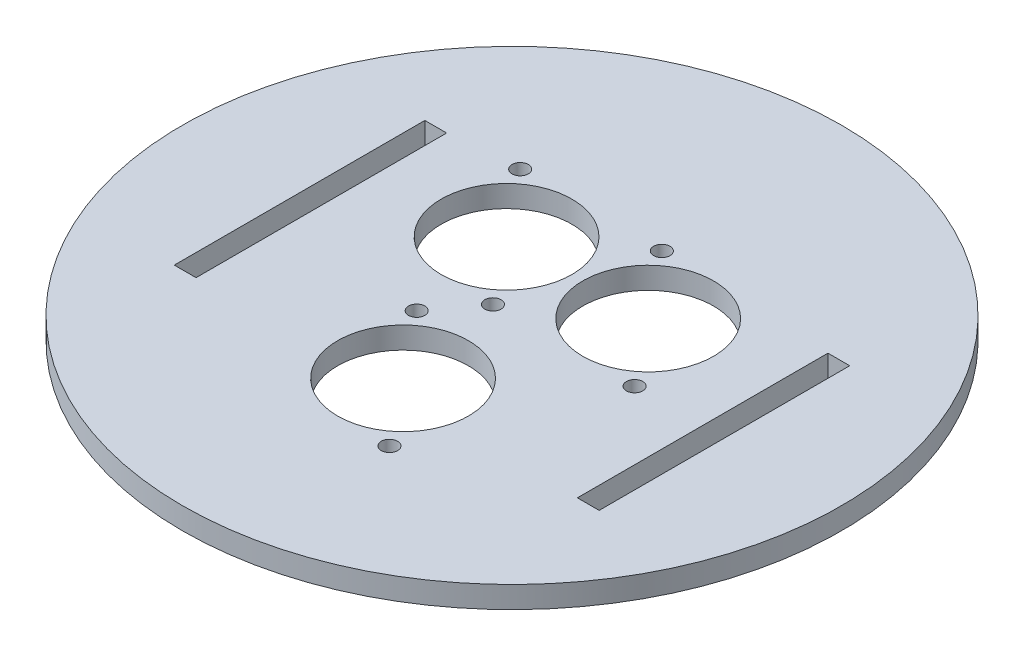
ISO-10303-21;
HEADER;
FILE_DESCRIPTION(('STEP AP214'),'2;1');
FILE_NAME('part.step','',(''),(''),'','','');
FILE_SCHEMA(('AUTOMOTIVE_DESIGN { 1 0 10303 214 1 1 1 1 }'));
ENDSEC;
DATA;
#1=APPLICATION_CONTEXT('core data for automotive mechanical design processes');
#2=APPLICATION_PROTOCOL_DEFINITION('international standard','automotive_design',2000,#1);
#3=PRODUCT_CONTEXT('',#1,'mechanical');
#4=PRODUCT('Part','Part','',(#3));
#5=PRODUCT_RELATED_PRODUCT_CATEGORY('part','',(#4));
#6=PRODUCT_DEFINITION_FORMATION('','',#4);
#7=PRODUCT_DEFINITION_CONTEXT('part definition',#1,'design');
#8=PRODUCT_DEFINITION('design','',#6,#7);
#9=PRODUCT_DEFINITION_SHAPE('','',#8);
#10=(LENGTH_UNIT() NAMED_UNIT(*) SI_UNIT(.MILLI.,.METRE.));
#11=(NAMED_UNIT(*) PLANE_ANGLE_UNIT() SI_UNIT($,.RADIAN.));
#12=(NAMED_UNIT(*) SI_UNIT($,.STERADIAN.) SOLID_ANGLE_UNIT());
#13=UNCERTAINTY_MEASURE_WITH_UNIT(LENGTH_MEASURE(1.E-05),#10,'distance_accuracy_value','');
#14=(GEOMETRIC_REPRESENTATION_CONTEXT(3) GLOBAL_UNCERTAINTY_ASSIGNED_CONTEXT((#13)) GLOBAL_UNIT_ASSIGNED_CONTEXT((#10,
#11,#12)) REPRESENTATION_CONTEXT('',''));
#15=CARTESIAN_POINT('',(0.,0.,0.));
#16=DIRECTION('',(0.,0.,1.));
#17=DIRECTION('',(1.,0.,0.));
#18=AXIS2_PLACEMENT_3D('',#15,#16,#17);
#19=CARTESIAN_POINT('',(0.,4.,0.));
#20=DIRECTION('',(0.,1.,0.));
#21=DIRECTION('',(0.,0.,1.));
#22=AXIS2_PLACEMENT_3D('',#19,#20,#21);
#23=PLANE('',#22);
#24=DIRECTION('',(0.,0.,-1.));
#25=VECTOR('',#24,1.);
#26=CARTESIAN_POINT('',(-35.,4.,23.));
#27=LINE('',#26,#25);
#28=CARTESIAN_POINT('',(-35.,4.,23.));
#29=VERTEX_POINT('',#28);
#30=CARTESIAN_POINT('',(-35.,4.,-23.));
#31=VERTEX_POINT('',#30);
#32=EDGE_CURVE('E130',#29,#31,#27,.T.);
#33=ORIENTED_EDGE('',*,*,#32,.F.);
#34=DIRECTION('',(1.,0.,0.));
#35=VECTOR('',#34,1.);
#36=CARTESIAN_POINT('',(-39.,4.,23.));
#37=LINE('',#36,#35);
#38=CARTESIAN_POINT('',(-39.,4.,23.));
#39=VERTEX_POINT('',#38);
#40=EDGE_CURVE('E138',#39,#29,#37,.T.);
#41=ORIENTED_EDGE('',*,*,#40,.F.);
#42=DIRECTION('',(0.,0.,1.));
#43=VECTOR('',#42,1.);
#44=CARTESIAN_POINT('',(-39.,4.,23.));
#45=LINE('',#44,#43);
#46=CARTESIAN_POINT('',(-39.,4.,-23.));
#47=VERTEX_POINT('',#46);
#48=EDGE_CURVE('E152',#47,#39,#45,.T.);
#49=ORIENTED_EDGE('',*,*,#48,.F.);
#50=DIRECTION('',(-1.,0.,0.));
#51=VECTOR('',#50,1.);
#52=CARTESIAN_POINT('',(-39.,4.,-23.));
#53=LINE('',#52,#51);
#54=EDGE_CURVE('E149',#31,#47,#53,.T.);
#55=ORIENTED_EDGE('',*,*,#54,.F.);
#56=EDGE_LOOP('',(#33,#41,#49,#55));
#57=FACE_BOUND('',#56,.T.);
#58=CARTESIAN_POINT('',(-22.5,4.,-24.));
#59=DIRECTION('',(0.,1.,0.));
#60=DIRECTION('',(0.,0.,1.));
#61=AXIS2_PLACEMENT_3D('',#58,#59,#60);
#62=CIRCLE('',#61,1.49999999999999);
#63=CARTESIAN_POINT('',(-22.5,4.,-22.5));
#64=VERTEX_POINT('',#63);
#65=EDGE_CURVE('E159',#64,#64,#62,.T.);
#66=ORIENTED_EDGE('',*,*,#65,.F.);
#67=EDGE_LOOP('',(#66));
#68=FACE_BOUND('',#67,.T.);
#69=CARTESIAN_POINT('',(-3.5,4.,0.));
#70=DIRECTION('',(0.,1.,0.));
#71=DIRECTION('',(0.,0.,1.));
#72=AXIS2_PLACEMENT_3D('',#69,#70,#71);
#73=CIRCLE('',#72,1.49999999999999);
#74=CARTESIAN_POINT('',(-3.5,4.,1.49999999999999));
#75=VERTEX_POINT('',#74);
#76=EDGE_CURVE('E171',#75,#75,#73,.T.);
#77=ORIENTED_EDGE('',*,*,#76,.F.);
#78=EDGE_LOOP('',(#77));
#79=FACE_BOUND('',#78,.T.);
#80=CARTESIAN_POINT('',(3.5,4.,-24.));
#81=DIRECTION('',(0.,1.,0.));
#82=DIRECTION('',(0.,0.,1.));
#83=AXIS2_PLACEMENT_3D('',#80,#81,#82);
#84=CIRCLE('',#83,1.49999999999999);
#85=CARTESIAN_POINT('',(3.5,4.,-22.5));
#86=VERTEX_POINT('',#85);
#87=EDGE_CURVE('E177',#86,#86,#84,.T.);
#88=ORIENTED_EDGE('',*,*,#87,.F.);
#89=EDGE_LOOP('',(#88));
#90=FACE_BOUND('',#89,.T.);
#91=CARTESIAN_POINT('',(22.5,4.,0.));
#92=DIRECTION('',(0.,1.,0.));
#93=DIRECTION('',(0.,0.,1.));
#94=AXIS2_PLACEMENT_3D('',#91,#92,#93);
#95=CIRCLE('',#94,1.49999999999999);
#96=CARTESIAN_POINT('',(22.5,4.,1.49999999999999));
#97=VERTEX_POINT('',#96);
#98=EDGE_CURVE('E183',#97,#97,#95,.T.);
#99=ORIENTED_EDGE('',*,*,#98,.F.);
#100=EDGE_LOOP('',(#99));
#101=FACE_BOUND('',#100,.T.);
#102=CARTESIAN_POINT('',(-9.5,4.,8.));
#103=DIRECTION('',(0.,1.,0.));
#104=DIRECTION('',(0.,0.,1.));
#105=AXIS2_PLACEMENT_3D('',#102,#103,#104);
#106=CIRCLE('',#105,1.49999999999999);
#107=CARTESIAN_POINT('',(-9.5,4.,9.49999999999999));
#108=VERTEX_POINT('',#107);
#109=EDGE_CURVE('E189',#108,#108,#106,.T.);
#110=ORIENTED_EDGE('',*,*,#109,.F.);
#111=EDGE_LOOP('',(#110));
#112=FACE_BOUND('',#111,.T.);
#113=CARTESIAN_POINT('',(9.5,4.,32.));
#114=DIRECTION('',(0.,1.,0.));
#115=DIRECTION('',(0.,0.,1.));
#116=AXIS2_PLACEMENT_3D('',#113,#114,#115);
#117=CIRCLE('',#116,1.49999999999999);
#118=CARTESIAN_POINT('',(9.5,4.,33.5));
#119=VERTEX_POINT('',#118);
#120=EDGE_CURVE('E195',#119,#119,#117,.T.);
#121=ORIENTED_EDGE('',*,*,#120,.F.);
#122=EDGE_LOOP('',(#121));
#123=FACE_BOUND('',#122,.T.);
#124=CARTESIAN_POINT('',(0.,4.,20.));
#125=DIRECTION('',(0.,1.,0.));
#126=DIRECTION('',(0.,0.,1.));
#127=AXIS2_PLACEMENT_3D('',#124,#125,#126);
#128=CIRCLE('',#127,12.);
#129=CARTESIAN_POINT('',(0.,4.,32.));
#130=VERTEX_POINT('',#129);
#131=EDGE_CURVE('E205',#130,#130,#128,.T.);
#132=ORIENTED_EDGE('',*,*,#131,.F.);
#133=EDGE_LOOP('',(#132));
#134=FACE_BOUND('',#133,.T.);
#135=CARTESIAN_POINT('',(13.,4.,-12.));
#136=DIRECTION('',(0.,1.,0.));
#137=DIRECTION('',(0.,0.,1.));
#138=AXIS2_PLACEMENT_3D('',#135,#136,#137);
#139=CIRCLE('',#138,12.);
#140=CARTESIAN_POINT('',(13.,4.,0.));
#141=VERTEX_POINT('',#140);
#142=EDGE_CURVE('E208',#141,#141,#139,.T.);
#143=ORIENTED_EDGE('',*,*,#142,.F.);
#144=EDGE_LOOP('',(#143));
#145=FACE_BOUND('',#144,.T.);
#146=CARTESIAN_POINT('',(-13.,4.,-12.));
#147=DIRECTION('',(0.,1.,0.));
#148=DIRECTION('',(0.,0.,1.));
#149=AXIS2_PLACEMENT_3D('',#146,#147,#148);
#150=CIRCLE('',#149,12.);
#151=CARTESIAN_POINT('',(-13.,4.,0.));
#152=VERTEX_POINT('',#151);
#153=EDGE_CURVE('E214',#152,#152,#150,.T.);
#154=ORIENTED_EDGE('',*,*,#153,.F.);
#155=EDGE_LOOP('',(#154));
#156=FACE_BOUND('',#155,.T.);
#157=CARTESIAN_POINT('',(0.,4.,0.));
#158=DIRECTION('',(0.,1.,0.));
#159=DIRECTION('',(0.,0.,1.));
#160=AXIS2_PLACEMENT_3D('',#157,#158,#159);
#161=CIRCLE('',#160,60.5);
#162=CARTESIAN_POINT('',(0.,4.,60.5));
#163=VERTEX_POINT('',#162);
#164=EDGE_CURVE('E12',#163,#163,#161,.T.);
#165=ORIENTED_EDGE('',*,*,#164,.T.);
#166=EDGE_LOOP('',(#165));
#167=FACE_BOUND('',#166,.T.);
#168=DIRECTION('',(-1.,0.,0.));
#169=VECTOR('',#168,1.);
#170=CARTESIAN_POINT('',(39.,4.,23.));
#171=LINE('',#170,#169);
#172=CARTESIAN_POINT('',(39.,4.,23.));
#173=VERTEX_POINT('',#172);
#174=CARTESIAN_POINT('',(35.,4.,23.));
#175=VERTEX_POINT('',#174);
#176=EDGE_CURVE('E124',#173,#175,#171,.T.);
#177=ORIENTED_EDGE('',*,*,#176,.T.);
#178=DIRECTION('',(0.,0.,-1.));
#179=VECTOR('',#178,1.);
#180=CARTESIAN_POINT('',(35.,4.,23.));
#181=LINE('',#180,#179);
#182=CARTESIAN_POINT('',(35.,4.,-23.));
#183=VERTEX_POINT('',#182);
#184=EDGE_CURVE('E49',#175,#183,#181,.T.);
#185=ORIENTED_EDGE('',*,*,#184,.T.);
#186=DIRECTION('',(1.,0.,0.));
#187=VECTOR('',#186,1.);
#188=CARTESIAN_POINT('',(39.,4.,-23.));
#189=LINE('',#188,#187);
#190=CARTESIAN_POINT('',(39.,4.,-23.));
#191=VERTEX_POINT('',#190);
#192=EDGE_CURVE('E115',#183,#191,#189,.T.);
#193=ORIENTED_EDGE('',*,*,#192,.T.);
#194=DIRECTION('',(0.,0.,1.));
#195=VECTOR('',#194,1.);
#196=CARTESIAN_POINT('',(39.,4.,23.));
#197=LINE('',#196,#195);
#198=EDGE_CURVE('E118',#191,#173,#197,.T.);
#199=ORIENTED_EDGE('',*,*,#198,.T.);
#200=EDGE_LOOP('',(#177,#185,#193,#199));
#201=FACE_BOUND('',#200,.T.);
#202=ADVANCED_FACE('F34',(#57,#68,#79,#90,#101,#112,#123,#134,#145,#156,#167,#201),#23,.T.);
#203=CARTESIAN_POINT('',(0.,0.,0.));
#204=DIRECTION('',(0.,1.,0.));
#205=DIRECTION('',(0.,0.,1.));
#206=AXIS2_PLACEMENT_3D('',#203,#204,#205);
#207=PLANE('',#206);
#208=CARTESIAN_POINT('',(0.,0.,0.));
#209=DIRECTION('',(0.,1.,0.));
#210=DIRECTION('',(0.,0.,1.));
#211=AXIS2_PLACEMENT_3D('',#208,#209,#210);
#212=CIRCLE('',#211,60.5);
#213=CARTESIAN_POINT('',(0.,0.,60.5));
#214=VERTEX_POINT('',#213);
#215=EDGE_CURVE('E38',#214,#214,#212,.T.);
#216=ORIENTED_EDGE('',*,*,#215,.F.);
#217=EDGE_LOOP('',(#216));
#218=FACE_BOUND('',#217,.T.);
#219=CARTESIAN_POINT('',(-13.,0.,-12.));
#220=DIRECTION('',(0.,1.,0.));
#221=DIRECTION('',(0.,0.,1.));
#222=AXIS2_PLACEMENT_3D('',#219,#220,#221);
#223=CIRCLE('',#222,12.);
#224=CARTESIAN_POINT('',(-13.,0.,0.));
#225=VERTEX_POINT('',#224);
#226=EDGE_CURVE('E201',#225,#225,#223,.T.);
#227=ORIENTED_EDGE('',*,*,#226,.T.);
#228=EDGE_LOOP('',(#227));
#229=FACE_BOUND('',#228,.T.);
#230=CARTESIAN_POINT('',(13.,0.,-12.));
#231=DIRECTION('',(0.,1.,0.));
#232=DIRECTION('',(0.,0.,1.));
#233=AXIS2_PLACEMENT_3D('',#230,#231,#232);
#234=CIRCLE('',#233,12.);
#235=CARTESIAN_POINT('',(13.,0.,0.));
#236=VERTEX_POINT('',#235);
#237=EDGE_CURVE('E211',#236,#236,#234,.T.);
#238=ORIENTED_EDGE('',*,*,#237,.T.);
#239=EDGE_LOOP('',(#238));
#240=FACE_BOUND('',#239,.T.);
#241=CARTESIAN_POINT('',(0.,0.,20.));
#242=DIRECTION('',(0.,1.,0.));
#243=DIRECTION('',(0.,0.,1.));
#244=AXIS2_PLACEMENT_3D('',#241,#242,#243);
#245=CIRCLE('',#244,12.);
#246=CARTESIAN_POINT('',(0.,0.,32.));
#247=VERTEX_POINT('',#246);
#248=EDGE_CURVE('E202',#247,#247,#245,.T.);
#249=ORIENTED_EDGE('',*,*,#248,.T.);
#250=EDGE_LOOP('',(#249));
#251=FACE_BOUND('',#250,.T.);
#252=CARTESIAN_POINT('',(9.5,0.,32.));
#253=DIRECTION('',(0.,1.,0.));
#254=DIRECTION('',(0.,0.,1.));
#255=AXIS2_PLACEMENT_3D('',#252,#253,#254);
#256=CIRCLE('',#255,1.5);
#257=CARTESIAN_POINT('',(9.5,0.,33.5));
#258=VERTEX_POINT('',#257);
#259=EDGE_CURVE('E198',#258,#258,#256,.T.);
#260=ORIENTED_EDGE('',*,*,#259,.T.);
#261=EDGE_LOOP('',(#260));
#262=FACE_BOUND('',#261,.T.);
#263=CARTESIAN_POINT('',(-9.5,0.,8.));
#264=DIRECTION('',(0.,1.,0.));
#265=DIRECTION('',(0.,0.,1.));
#266=AXIS2_PLACEMENT_3D('',#263,#264,#265);
#267=CIRCLE('',#266,1.5);
#268=CARTESIAN_POINT('',(-9.5,0.,9.5));
#269=VERTEX_POINT('',#268);
#270=EDGE_CURVE('E192',#269,#269,#267,.T.);
#271=ORIENTED_EDGE('',*,*,#270,.T.);
#272=EDGE_LOOP('',(#271));
#273=FACE_BOUND('',#272,.T.);
#274=CARTESIAN_POINT('',(22.5,0.,0.));
#275=DIRECTION('',(0.,1.,0.));
#276=DIRECTION('',(0.,0.,1.));
#277=AXIS2_PLACEMENT_3D('',#274,#275,#276);
#278=CIRCLE('',#277,1.5);
#279=CARTESIAN_POINT('',(22.5,0.,1.5));
#280=VERTEX_POINT('',#279);
#281=EDGE_CURVE('E186',#280,#280,#278,.T.);
#282=ORIENTED_EDGE('',*,*,#281,.T.);
#283=EDGE_LOOP('',(#282));
#284=FACE_BOUND('',#283,.T.);
#285=CARTESIAN_POINT('',(3.5,0.,-24.));
#286=DIRECTION('',(0.,1.,0.));
#287=DIRECTION('',(0.,0.,1.));
#288=AXIS2_PLACEMENT_3D('',#285,#286,#287);
#289=CIRCLE('',#288,1.5);
#290=CARTESIAN_POINT('',(3.5,0.,-22.5));
#291=VERTEX_POINT('',#290);
#292=EDGE_CURVE('E180',#291,#291,#289,.T.);
#293=ORIENTED_EDGE('',*,*,#292,.T.);
#294=EDGE_LOOP('',(#293));
#295=FACE_BOUND('',#294,.T.);
#296=CARTESIAN_POINT('',(-3.5,0.,0.));
#297=DIRECTION('',(0.,1.,0.));
#298=DIRECTION('',(0.,0.,1.));
#299=AXIS2_PLACEMENT_3D('',#296,#297,#298);
#300=CIRCLE('',#299,1.5);
#301=CARTESIAN_POINT('',(-3.5,0.,1.50000000000001));
#302=VERTEX_POINT('',#301);
#303=EDGE_CURVE('E174',#302,#302,#300,.T.);
#304=ORIENTED_EDGE('',*,*,#303,.T.);
#305=EDGE_LOOP('',(#304));
#306=FACE_BOUND('',#305,.T.);
#307=CARTESIAN_POINT('',(-22.5,0.,-24.));
#308=DIRECTION('',(0.,1.,0.));
#309=DIRECTION('',(0.,0.,1.));
#310=AXIS2_PLACEMENT_3D('',#307,#308,#309);
#311=CIRCLE('',#310,1.5);
#312=CARTESIAN_POINT('',(-22.5,0.,-22.5));
#313=VERTEX_POINT('',#312);
#314=EDGE_CURVE('E168',#313,#313,#311,.T.);
#315=ORIENTED_EDGE('',*,*,#314,.T.);
#316=EDGE_LOOP('',(#315));
#317=FACE_BOUND('',#316,.T.);
#318=DIRECTION('',(1.,0.,0.));
#319=VECTOR('',#318,1.);
#320=CARTESIAN_POINT('',(-39.,0.,23.));
#321=LINE('',#320,#319);
#322=CARTESIAN_POINT('',(-39.,0.,23.));
#323=VERTEX_POINT('',#322);
#324=CARTESIAN_POINT('',(-35.,0.,23.));
#325=VERTEX_POINT('',#324);
#326=EDGE_CURVE('E144',#323,#325,#321,.T.);
#327=ORIENTED_EDGE('',*,*,#326,.T.);
#328=DIRECTION('',(0.,0.,-1.));
#329=VECTOR('',#328,1.);
#330=CARTESIAN_POINT('',(-35.,0.,23.));
#331=LINE('',#330,#329);
#332=CARTESIAN_POINT('',(-35.,0.,-23.));
#333=VERTEX_POINT('',#332);
#334=EDGE_CURVE('E134',#325,#333,#331,.T.);
#335=ORIENTED_EDGE('',*,*,#334,.T.);
#336=DIRECTION('',(-1.,0.,0.));
#337=VECTOR('',#336,1.);
#338=CARTESIAN_POINT('',(-39.,0.,-23.));
#339=LINE('',#338,#337);
#340=CARTESIAN_POINT('',(-39.,0.,-23.));
#341=VERTEX_POINT('',#340);
#342=EDGE_CURVE('E137',#333,#341,#339,.T.);
#343=ORIENTED_EDGE('',*,*,#342,.T.);
#344=DIRECTION('',(0.,0.,1.));
#345=VECTOR('',#344,1.);
#346=CARTESIAN_POINT('',(-39.,0.,23.));
#347=LINE('',#346,#345);
#348=EDGE_CURVE('E141',#341,#323,#347,.T.);
#349=ORIENTED_EDGE('',*,*,#348,.T.);
#350=EDGE_LOOP('',(#327,#335,#343,#349));
#351=FACE_BOUND('',#350,.T.);
#352=DIRECTION('',(0.,0.,-1.));
#353=VECTOR('',#352,1.);
#354=CARTESIAN_POINT('',(35.,0.,23.));
#355=LINE('',#354,#353);
#356=CARTESIAN_POINT('',(35.,0.,23.));
#357=VERTEX_POINT('',#356);
#358=CARTESIAN_POINT('',(35.,0.,-23.));
#359=VERTEX_POINT('',#358);
#360=EDGE_CURVE('E107',#357,#359,#355,.T.);
#361=ORIENTED_EDGE('',*,*,#360,.F.);
#362=DIRECTION('',(-1.,0.,0.));
#363=VECTOR('',#362,1.);
#364=CARTESIAN_POINT('',(39.,0.,23.));
#365=LINE('',#364,#363);
#366=CARTESIAN_POINT('',(39.,0.,23.));
#367=VERTEX_POINT('',#366);
#368=EDGE_CURVE('E99',#367,#357,#365,.T.);
#369=ORIENTED_EDGE('',*,*,#368,.F.);
#370=DIRECTION('',(0.,0.,1.));
#371=VECTOR('',#370,1.);
#372=CARTESIAN_POINT('',(39.,0.,23.));
#373=LINE('',#372,#371);
#374=CARTESIAN_POINT('',(39.,0.,-23.));
#375=VERTEX_POINT('',#374);
#376=EDGE_CURVE('E106',#375,#367,#373,.T.);
#377=ORIENTED_EDGE('',*,*,#376,.F.);
#378=DIRECTION('',(1.,0.,0.));
#379=VECTOR('',#378,1.);
#380=CARTESIAN_POINT('',(39.,0.,-23.));
#381=LINE('',#380,#379);
#382=EDGE_CURVE('E111',#359,#375,#381,.T.);
#383=ORIENTED_EDGE('',*,*,#382,.F.);
#384=EDGE_LOOP('',(#361,#369,#377,#383));
#385=FACE_BOUND('',#384,.T.);
#386=ADVANCED_FACE('F114',(#218,#229,#240,#251,#262,#273,#284,#295,#306,#317,#351,#385),#207,.F.);
#387=CARTESIAN_POINT('',(0.,4.,0.));
#388=DIRECTION('',(0.,-1.,0.));
#389=DIRECTION('',(0.,0.,-1.));
#390=AXIS2_PLACEMENT_3D('',#387,#388,#389);
#391=CYLINDRICAL_SURFACE('',#390,60.5);
#392=ORIENTED_EDGE('',*,*,#164,.F.);
#393=EDGE_LOOP('',(#392));
#394=FACE_BOUND('',#393,.T.);
#395=ORIENTED_EDGE('',*,*,#215,.T.);
#396=EDGE_LOOP('',(#395));
#397=FACE_BOUND('',#396,.T.);
#398=ADVANCED_FACE('F36',(#394,#397),#391,.T.);
#399=CARTESIAN_POINT('',(-13.,0.,-12.));
#400=DIRECTION('',(0.,1.,0.));
#401=DIRECTION('',(0.,0.,1.));
#402=AXIS2_PLACEMENT_3D('',#399,#400,#401);
#403=CYLINDRICAL_SURFACE('',#402,12.);
#404=ORIENTED_EDGE('',*,*,#226,.F.);
#405=EDGE_LOOP('',(#404));
#406=FACE_BOUND('',#405,.T.);
#407=ORIENTED_EDGE('',*,*,#153,.T.);
#408=EDGE_LOOP('',(#407));
#409=FACE_BOUND('',#408,.T.);
#410=ADVANCED_FACE('F222',(#406,#409),#403,.F.);
#411=CARTESIAN_POINT('',(13.,0.,-12.));
#412=DIRECTION('',(0.,1.,0.));
#413=DIRECTION('',(0.,0.,1.));
#414=AXIS2_PLACEMENT_3D('',#411,#412,#413);
#415=CYLINDRICAL_SURFACE('',#414,12.);
#416=ORIENTED_EDGE('',*,*,#237,.F.);
#417=EDGE_LOOP('',(#416));
#418=FACE_BOUND('',#417,.T.);
#419=ORIENTED_EDGE('',*,*,#142,.T.);
#420=EDGE_LOOP('',(#419));
#421=FACE_BOUND('',#420,.T.);
#422=ADVANCED_FACE('F225',(#418,#421),#415,.F.);
#423=CARTESIAN_POINT('',(0.,0.,20.));
#424=DIRECTION('',(0.,1.,0.));
#425=DIRECTION('',(0.,0.,1.));
#426=AXIS2_PLACEMENT_3D('',#423,#424,#425);
#427=CYLINDRICAL_SURFACE('',#426,12.);
#428=ORIENTED_EDGE('',*,*,#248,.F.);
#429=EDGE_LOOP('',(#428));
#430=FACE_BOUND('',#429,.T.);
#431=ORIENTED_EDGE('',*,*,#131,.T.);
#432=EDGE_LOOP('',(#431));
#433=FACE_BOUND('',#432,.T.);
#434=ADVANCED_FACE('F291',(#430,#433),#427,.F.);
#435=CARTESIAN_POINT('',(9.5,4.,32.));
#436=DIRECTION('',(0.,1.,0.));
#437=DIRECTION('',(0.,0.,1.));
#438=AXIS2_PLACEMENT_3D('',#435,#436,#437);
#439=CYLINDRICAL_SURFACE('',#438,1.49999999999999);
#440=ORIENTED_EDGE('',*,*,#259,.F.);
#441=EDGE_LOOP('',(#440));
#442=FACE_BOUND('',#441,.T.);
#443=ORIENTED_EDGE('',*,*,#120,.T.);
#444=EDGE_LOOP('',(#443));
#445=FACE_BOUND('',#444,.T.);
#446=ADVANCED_FACE('F287',(#442,#445),#439,.F.);
#447=CARTESIAN_POINT('',(-9.5,4.,8.));
#448=DIRECTION('',(0.,1.,0.));
#449=DIRECTION('',(0.,0.,1.));
#450=AXIS2_PLACEMENT_3D('',#447,#448,#449);
#451=CYLINDRICAL_SURFACE('',#450,1.49999999999999);
#452=ORIENTED_EDGE('',*,*,#270,.F.);
#453=EDGE_LOOP('',(#452));
#454=FACE_BOUND('',#453,.T.);
#455=ORIENTED_EDGE('',*,*,#109,.T.);
#456=EDGE_LOOP('',(#455));
#457=FACE_BOUND('',#456,.T.);
#458=ADVANCED_FACE('F283',(#454,#457),#451,.F.);
#459=CARTESIAN_POINT('',(22.5,4.,0.));
#460=DIRECTION('',(0.,1.,0.));
#461=DIRECTION('',(0.,0.,1.));
#462=AXIS2_PLACEMENT_3D('',#459,#460,#461);
#463=CYLINDRICAL_SURFACE('',#462,1.49999999999999);
#464=ORIENTED_EDGE('',*,*,#281,.F.);
#465=EDGE_LOOP('',(#464));
#466=FACE_BOUND('',#465,.T.);
#467=ORIENTED_EDGE('',*,*,#98,.T.);
#468=EDGE_LOOP('',(#467));
#469=FACE_BOUND('',#468,.T.);
#470=ADVANCED_FACE('F279',(#466,#469),#463,.F.);
#471=CARTESIAN_POINT('',(3.5,4.,-24.));
#472=DIRECTION('',(0.,1.,0.));
#473=DIRECTION('',(0.,0.,1.));
#474=AXIS2_PLACEMENT_3D('',#471,#472,#473);
#475=CYLINDRICAL_SURFACE('',#474,1.49999999999999);
#476=ORIENTED_EDGE('',*,*,#292,.F.);
#477=EDGE_LOOP('',(#476));
#478=FACE_BOUND('',#477,.T.);
#479=ORIENTED_EDGE('',*,*,#87,.T.);
#480=EDGE_LOOP('',(#479));
#481=FACE_BOUND('',#480,.T.);
#482=ADVANCED_FACE('F275',(#478,#481),#475,.F.);
#483=CARTESIAN_POINT('',(-3.5,4.,0.));
#484=DIRECTION('',(0.,1.,0.));
#485=DIRECTION('',(0.,0.,1.));
#486=AXIS2_PLACEMENT_3D('',#483,#484,#485);
#487=CYLINDRICAL_SURFACE('',#486,1.49999999999999);
#488=ORIENTED_EDGE('',*,*,#303,.F.);
#489=EDGE_LOOP('',(#488));
#490=FACE_BOUND('',#489,.T.);
#491=ORIENTED_EDGE('',*,*,#76,.T.);
#492=EDGE_LOOP('',(#491));
#493=FACE_BOUND('',#492,.T.);
#494=ADVANCED_FACE('F271',(#490,#493),#487,.F.);
#495=CARTESIAN_POINT('',(-22.5,4.,-24.));
#496=DIRECTION('',(0.,1.,0.));
#497=DIRECTION('',(0.,0.,1.));
#498=AXIS2_PLACEMENT_3D('',#495,#496,#497);
#499=CYLINDRICAL_SURFACE('',#498,1.49999999999999);
#500=ORIENTED_EDGE('',*,*,#314,.F.);
#501=EDGE_LOOP('',(#500));
#502=FACE_BOUND('',#501,.T.);
#503=ORIENTED_EDGE('',*,*,#65,.T.);
#504=EDGE_LOOP('',(#503));
#505=FACE_BOUND('',#504,.T.);
#506=ADVANCED_FACE('F267',(#502,#505),#499,.F.);
#507=CARTESIAN_POINT('',(-35.,0.,23.));
#508=DIRECTION('',(1.,0.,0.));
#509=DIRECTION('',(0.,0.,-1.));
#510=AXIS2_PLACEMENT_3D('',#507,#508,#509);
#511=PLANE('',#510);
#512=ORIENTED_EDGE('',*,*,#32,.T.);
#513=DIRECTION('',(0.,1.,0.));
#514=VECTOR('',#513,1.);
#515=CARTESIAN_POINT('',(-35.,0.,-23.));
#516=LINE('',#515,#514);
#517=EDGE_CURVE('E147',#333,#31,#516,.T.);
#518=ORIENTED_EDGE('',*,*,#517,.F.);
#519=ORIENTED_EDGE('',*,*,#334,.F.);
#520=DIRECTION('',(0.,1.,0.));
#521=VECTOR('',#520,1.);
#522=CARTESIAN_POINT('',(-35.,0.,23.));
#523=LINE('',#522,#521);
#524=EDGE_CURVE('E157',#325,#29,#523,.T.);
#525=ORIENTED_EDGE('',*,*,#524,.T.);
#526=EDGE_LOOP('',(#512,#518,#519,#525));
#527=FACE_BOUND('',#526,.T.);
#528=ADVANCED_FACE('F257',(#527),#511,.F.);
#529=CARTESIAN_POINT('',(-39.,0.,23.));
#530=DIRECTION('',(0.,0.,1.));
#531=DIRECTION('',(1.,0.,0.));
#532=AXIS2_PLACEMENT_3D('',#529,#530,#531);
#533=PLANE('',#532);
#534=ORIENTED_EDGE('',*,*,#40,.T.);
#535=ORIENTED_EDGE('',*,*,#524,.F.);
#536=ORIENTED_EDGE('',*,*,#326,.F.);
#537=DIRECTION('',(0.,1.,0.));
#538=VECTOR('',#537,1.);
#539=CARTESIAN_POINT('',(-39.,0.,23.));
#540=LINE('',#539,#538);
#541=EDGE_CURVE('E160',#323,#39,#540,.T.);
#542=ORIENTED_EDGE('',*,*,#541,.T.);
#543=EDGE_LOOP('',(#534,#535,#536,#542));
#544=FACE_BOUND('',#543,.T.);
#545=ADVANCED_FACE('F253',(#544),#533,.F.);
#546=CARTESIAN_POINT('',(-39.,0.,23.));
#547=DIRECTION('',(-1.,0.,0.));
#548=DIRECTION('',(0.,0.,1.));
#549=AXIS2_PLACEMENT_3D('',#546,#547,#548);
#550=PLANE('',#549);
#551=ORIENTED_EDGE('',*,*,#48,.T.);
#552=ORIENTED_EDGE('',*,*,#541,.F.);
#553=ORIENTED_EDGE('',*,*,#348,.F.);
#554=DIRECTION('',(0.,1.,0.));
#555=VECTOR('',#554,1.);
#556=CARTESIAN_POINT('',(-39.,0.,-23.));
#557=LINE('',#556,#555);
#558=EDGE_CURVE('E162',#341,#47,#557,.T.);
#559=ORIENTED_EDGE('',*,*,#558,.T.);
#560=EDGE_LOOP('',(#551,#552,#553,#559));
#561=FACE_BOUND('',#560,.T.);
#562=ADVANCED_FACE('F256',(#561),#550,.F.);
#563=CARTESIAN_POINT('',(-39.,0.,-23.));
#564=DIRECTION('',(0.,0.,-1.));
#565=DIRECTION('',(-1.,0.,0.));
#566=AXIS2_PLACEMENT_3D('',#563,#564,#565);
#567=PLANE('',#566);
#568=ORIENTED_EDGE('',*,*,#54,.T.);
#569=ORIENTED_EDGE('',*,*,#558,.F.);
#570=ORIENTED_EDGE('',*,*,#342,.F.);
#571=ORIENTED_EDGE('',*,*,#517,.T.);
#572=EDGE_LOOP('',(#568,#569,#570,#571));
#573=FACE_BOUND('',#572,.T.);
#574=ADVANCED_FACE('F248',(#573),#567,.F.);
#575=CARTESIAN_POINT('',(35.,0.,23.));
#576=DIRECTION('',(1.,0.,0.));
#577=DIRECTION('',(0.,0.,-1.));
#578=AXIS2_PLACEMENT_3D('',#575,#576,#577);
#579=PLANE('',#578);
#580=ORIENTED_EDGE('',*,*,#184,.F.);
#581=DIRECTION('',(0.,1.,0.));
#582=VECTOR('',#581,1.);
#583=CARTESIAN_POINT('',(35.,0.,23.));
#584=LINE('',#583,#582);
#585=EDGE_CURVE('E101',#357,#175,#584,.T.);
#586=ORIENTED_EDGE('',*,*,#585,.F.);
#587=ORIENTED_EDGE('',*,*,#360,.T.);
#588=DIRECTION('',(0.,1.,0.));
#589=VECTOR('',#588,1.);
#590=CARTESIAN_POINT('',(35.,0.,-23.));
#591=LINE('',#590,#589);
#592=EDGE_CURVE('E128',#359,#183,#591,.T.);
#593=ORIENTED_EDGE('',*,*,#592,.T.);
#594=EDGE_LOOP('',(#580,#586,#587,#593));
#595=FACE_BOUND('',#594,.T.);
#596=ADVANCED_FACE('F109',(#595),#579,.T.);
#597=CARTESIAN_POINT('',(39.,0.,-23.));
#598=DIRECTION('',(0.,0.,1.));
#599=DIRECTION('',(1.,0.,0.));
#600=AXIS2_PLACEMENT_3D('',#597,#598,#599);
#601=PLANE('',#600);
#602=ORIENTED_EDGE('',*,*,#192,.F.);
#603=ORIENTED_EDGE('',*,*,#592,.F.);
#604=ORIENTED_EDGE('',*,*,#382,.T.);
#605=DIRECTION('',(0.,1.,0.));
#606=VECTOR('',#605,1.);
#607=CARTESIAN_POINT('',(39.,0.,-23.));
#608=LINE('',#607,#606);
#609=EDGE_CURVE('E131',#375,#191,#608,.T.);
#610=ORIENTED_EDGE('',*,*,#609,.T.);
#611=EDGE_LOOP('',(#602,#603,#604,#610));
#612=FACE_BOUND('',#611,.T.);
#613=ADVANCED_FACE('F240',(#612),#601,.T.);
#614=CARTESIAN_POINT('',(39.,0.,23.));
#615=DIRECTION('',(-1.,0.,0.));
#616=DIRECTION('',(0.,0.,1.));
#617=AXIS2_PLACEMENT_3D('',#614,#615,#616);
#618=PLANE('',#617);
#619=ORIENTED_EDGE('',*,*,#198,.F.);
#620=ORIENTED_EDGE('',*,*,#609,.F.);
#621=ORIENTED_EDGE('',*,*,#376,.T.);
#622=DIRECTION('',(0.,1.,0.));
#623=VECTOR('',#622,1.);
#624=CARTESIAN_POINT('',(39.,0.,23.));
#625=LINE('',#624,#623);
#626=EDGE_CURVE('E57',#367,#173,#625,.T.);
#627=ORIENTED_EDGE('',*,*,#626,.T.);
#628=EDGE_LOOP('',(#619,#620,#621,#627));
#629=FACE_BOUND('',#628,.T.);
#630=ADVANCED_FACE('F238',(#629),#618,.T.);
#631=CARTESIAN_POINT('',(39.,0.,23.));
#632=DIRECTION('',(0.,0.,-1.));
#633=DIRECTION('',(-1.,0.,0.));
#634=AXIS2_PLACEMENT_3D('',#631,#632,#633);
#635=PLANE('',#634);
#636=ORIENTED_EDGE('',*,*,#176,.F.);
#637=ORIENTED_EDGE('',*,*,#626,.F.);
#638=ORIENTED_EDGE('',*,*,#368,.T.);
#639=ORIENTED_EDGE('',*,*,#585,.T.);
#640=EDGE_LOOP('',(#636,#637,#638,#639));
#641=FACE_BOUND('',#640,.T.);
#642=ADVANCED_FACE('F100',(#641),#635,.T.);
#643=CLOSED_SHELL('',(#202,#386,#398,#410,#422,#434,#446,#458,#470,#482,#494,#506,#528,#545,
#562,#574,#596,#613,#630,#642));
#644=MANIFOLD_SOLID_BREP('B2',#643);
#645=ADVANCED_BREP_SHAPE_REPRESENTATION('',(#18,#644),#14);
#646=SHAPE_DEFINITION_REPRESENTATION(#9,#645);
ENDSEC;
END-ISO-10303-21;
